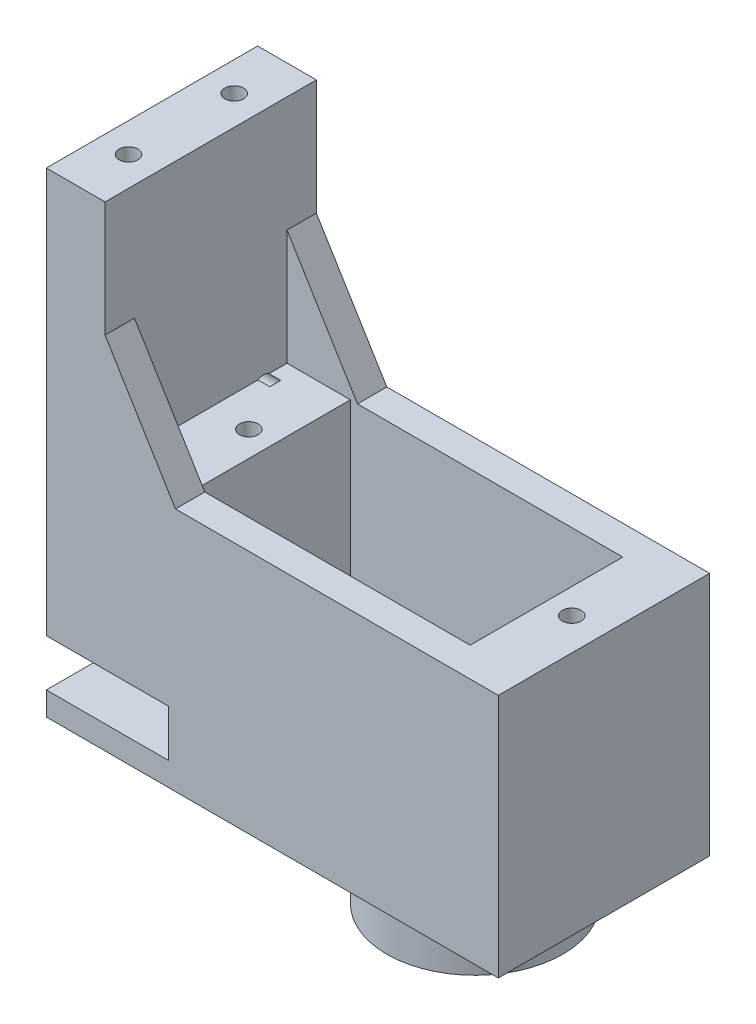
ISO-10303-21;
HEADER;
FILE_DESCRIPTION(('STEP AP214'),'2;1');
FILE_NAME('part.step','',(''),(''),'','','');
FILE_SCHEMA(('AUTOMOTIVE_DESIGN { 1 0 10303 214 1 1 1 1 }'));
ENDSEC;
DATA;
#1=APPLICATION_CONTEXT('core data for automotive mechanical design processes');
#2=APPLICATION_PROTOCOL_DEFINITION('international standard','automotive_design',2000,#1);
#3=PRODUCT_CONTEXT('',#1,'mechanical');
#4=PRODUCT('Part','Part','',(#3));
#5=PRODUCT_RELATED_PRODUCT_CATEGORY('part','',(#4));
#6=PRODUCT_DEFINITION_FORMATION('','',#4);
#7=PRODUCT_DEFINITION_CONTEXT('part definition',#1,'design');
#8=PRODUCT_DEFINITION('design','',#6,#7);
#9=PRODUCT_DEFINITION_SHAPE('','',#8);
#10=(LENGTH_UNIT() NAMED_UNIT(*) SI_UNIT(.MILLI.,.METRE.));
#11=(NAMED_UNIT(*) PLANE_ANGLE_UNIT() SI_UNIT($,.RADIAN.));
#12=(NAMED_UNIT(*) SI_UNIT($,.STERADIAN.) SOLID_ANGLE_UNIT());
#13=UNCERTAINTY_MEASURE_WITH_UNIT(LENGTH_MEASURE(1.E-05),#10,'distance_accuracy_value','');
#14=(GEOMETRIC_REPRESENTATION_CONTEXT(3) GLOBAL_UNCERTAINTY_ASSIGNED_CONTEXT((#13)) GLOBAL_UNIT_ASSIGNED_CONTEXT((#10,
#11,#12)) REPRESENTATION_CONTEXT('',''));
#15=CARTESIAN_POINT('',(0.,0.,0.));
#16=DIRECTION('',(0.,0.,1.));
#17=DIRECTION('',(1.,0.,0.));
#18=AXIS2_PLACEMENT_3D('',#15,#16,#17);
#19=CARTESIAN_POINT('',(0.,5.15,0.));
#20=DIRECTION('',(0.,-1.,0.));
#21=DIRECTION('',(0.,0.,-1.));
#22=AXIS2_PLACEMENT_3D('',#19,#20,#21);
#23=PLANE('',#22);
#24=CARTESIAN_POINT('',(-13.75,5.15,0.));
#25=DIRECTION('',(0.,1.,0.));
#26=DIRECTION('',(0.,0.,1.));
#27=AXIS2_PLACEMENT_3D('',#24,#25,#26);
#28=CIRCLE('',#27,0.800000000000001);
#29=CARTESIAN_POINT('',(-13.75,5.15,0.800000000000001));
#30=VERTEX_POINT('',#29);
#31=EDGE_CURVE('E268',#30,#30,#28,.F.);
#32=ORIENTED_EDGE('',*,*,#31,.T.);
#33=EDGE_LOOP('',(#32));
#34=FACE_BOUND('',#33,.T.);
#35=DIRECTION('',(-1.,0.,0.));
#36=VECTOR('',#35,1.);
#37=CARTESIAN_POINT('',(-16.,5.15,4.96636895265444));
#38=LINE('',#37,#36);
#39=CARTESIAN_POINT('',(-17.,5.15,4.96636895265444));
#40=VERTEX_POINT('',#39);
#41=CARTESIAN_POINT('',(-16.,5.15,4.96636895265444));
#42=VERTEX_POINT('',#41);
#43=EDGE_CURVE('E11',#40,#42,#38,.F.);
#44=ORIENTED_EDGE('',*,*,#43,.F.);
#45=DIRECTION('',(0.,0.,1.));
#46=VECTOR('',#45,1.);
#47=CARTESIAN_POINT('',(-17.,5.15,6.5));
#48=LINE('',#47,#46);
#49=CARTESIAN_POINT('',(-17.,5.15,6.5));
#50=VERTEX_POINT('',#49);
#51=EDGE_CURVE('E247',#40,#50,#48,.T.);
#52=ORIENTED_EDGE('',*,*,#51,.T.);
#53=DIRECTION('',(1.,0.,0.));
#54=VECTOR('',#53,1.);
#55=CARTESIAN_POINT('',(-17.,5.15,6.5));
#56=LINE('',#55,#54);
#57=CARTESIAN_POINT('',(-11.6,5.15,6.5));
#58=VERTEX_POINT('',#57);
#59=EDGE_CURVE('E255',#50,#58,#56,.T.);
#60=ORIENTED_EDGE('',*,*,#59,.T.);
#61=DIRECTION('',(0.,0.,1.));
#62=VECTOR('',#61,1.);
#63=CARTESIAN_POINT('',(-11.6,5.15,6.5));
#64=LINE('',#63,#62);
#65=CARTESIAN_POINT('',(-11.6,5.15,-6.5));
#66=VERTEX_POINT('',#65);
#67=EDGE_CURVE('E389',#66,#58,#64,.T.);
#68=ORIENTED_EDGE('',*,*,#67,.F.);
#69=DIRECTION('',(-1.,0.,0.));
#70=VECTOR('',#69,1.);
#71=CARTESIAN_POINT('',(-17.,5.15,-6.5));
#72=LINE('',#71,#70);
#73=CARTESIAN_POINT('',(-17.,5.15,-6.5));
#74=VERTEX_POINT('',#73);
#75=EDGE_CURVE('E260',#66,#74,#72,.T.);
#76=ORIENTED_EDGE('',*,*,#75,.T.);
#77=CARTESIAN_POINT('',(-17.,5.15,-4.96636895265444));
#78=VERTEX_POINT('',#77);
#79=EDGE_CURVE('E224',#74,#78,#48,.T.);
#80=ORIENTED_EDGE('',*,*,#79,.T.);
#81=DIRECTION('',(-1.,0.,0.));
#82=VECTOR('',#81,1.);
#83=CARTESIAN_POINT('',(-16.,5.15,-4.96636895265444));
#84=LINE('',#83,#82);
#85=CARTESIAN_POINT('',(-16.,5.15,-4.96636895265444));
#86=VERTEX_POINT('',#85);
#87=EDGE_CURVE('E210',#86,#78,#84,.T.);
#88=ORIENTED_EDGE('',*,*,#87,.F.);
#89=DIRECTION('',(0.,0.,1.));
#90=VECTOR('',#89,1.);
#91=CARTESIAN_POINT('',(-16.,5.15,0.));
#92=LINE('',#91,#90);
#93=CARTESIAN_POINT('',(-16.,5.15,-4.03363104734556));
#94=VERTEX_POINT('',#93);
#95=EDGE_CURVE('E204',#86,#94,#92,.T.);
#96=ORIENTED_EDGE('',*,*,#95,.T.);
#97=DIRECTION('',(-1.,0.,0.));
#98=VECTOR('',#97,1.);
#99=CARTESIAN_POINT('',(-16.,5.15,-4.03363104734556));
#100=LINE('',#99,#98);
#101=CARTESIAN_POINT('',(-17.,5.15,-4.03363104734556));
#102=VERTEX_POINT('',#101);
#103=EDGE_CURVE('E216',#102,#94,#100,.F.);
#104=ORIENTED_EDGE('',*,*,#103,.F.);
#105=CARTESIAN_POINT('',(-17.,5.15,4.03363104734556));
#106=VERTEX_POINT('',#105);
#107=EDGE_CURVE('E245',#102,#106,#48,.T.);
#108=ORIENTED_EDGE('',*,*,#107,.T.);
#109=DIRECTION('',(-1.,0.,0.));
#110=VECTOR('',#109,1.);
#111=CARTESIAN_POINT('',(-16.,5.15,4.03363104734556));
#112=LINE('',#111,#110);
#113=CARTESIAN_POINT('',(-16.,5.15,4.03363104734556));
#114=VERTEX_POINT('',#113);
#115=EDGE_CURVE('E48',#114,#106,#112,.T.);
#116=ORIENTED_EDGE('',*,*,#115,.F.);
#117=DIRECTION('',(0.,0.,1.));
#118=VECTOR('',#117,1.);
#119=CARTESIAN_POINT('',(-16.,5.15,0.));
#120=LINE('',#119,#118);
#121=EDGE_CURVE('E228',#114,#42,#120,.T.);
#122=ORIENTED_EDGE('',*,*,#121,.T.);
#123=EDGE_LOOP('',(#44,#52,#60,#68,#76,#80,#88,#96,#104,#108,#116,#122));
#124=FACE_BOUND('',#123,.T.);
#125=ADVANCED_FACE('F39',(#34,#124),#23,.F.);
#126=CARTESIAN_POINT('',(-11.,5.15,9.));
#127=DIRECTION('',(-0.853442833721127,-0.521186463341147,0.));
#128=DIRECTION('',(0.521186463341147,-0.853442833721127,0.));
#129=AXIS2_PLACEMENT_3D('',#126,#127,#128);
#130=PLANE('',#129);
#131=DIRECTION('',(0.,0.,-1.));
#132=VECTOR('',#131,1.);
#133=CARTESIAN_POINT('',(-17.,14.975,9.));
#134=LINE('',#133,#132);
#135=CARTESIAN_POINT('',(-17.,14.975,-6.5));
#136=VERTEX_POINT('',#135);
#137=CARTESIAN_POINT('',(-17.,14.975,-9.));
#138=VERTEX_POINT('',#137);
#139=EDGE_CURVE('E274',#136,#138,#134,.T.);
#140=ORIENTED_EDGE('',*,*,#139,.F.);
#141=DIRECTION('',(0.521186463341147,-0.853442833721127,0.));
#142=VECTOR('',#141,1.);
#143=CARTESIAN_POINT('',(-11.,5.15,-6.5));
#144=LINE('',#143,#142);
#145=CARTESIAN_POINT('',(-11.,5.15,-6.5));
#146=VERTEX_POINT('',#145);
#147=EDGE_CURVE('E211',#136,#146,#144,.T.);
#148=ORIENTED_EDGE('',*,*,#147,.T.);
#149=DIRECTION('',(0.,0.,-1.));
#150=VECTOR('',#149,1.);
#151=CARTESIAN_POINT('',(-11.,5.15,9.));
#152=LINE('',#151,#150);
#153=CARTESIAN_POINT('',(-11.,5.15,-9.));
#154=VERTEX_POINT('',#153);
#155=EDGE_CURVE('E283',#146,#154,#152,.T.);
#156=ORIENTED_EDGE('',*,*,#155,.T.);
#157=DIRECTION('',(-0.521186463341147,0.853442833721127,0.));
#158=VECTOR('',#157,1.);
#159=CARTESIAN_POINT('',(-11.,5.15,-9.));
#160=LINE('',#159,#158);
#161=EDGE_CURVE('E275',#154,#138,#160,.T.);
#162=ORIENTED_EDGE('',*,*,#161,.T.);
#163=EDGE_LOOP('',(#140,#148,#156,#162));
#164=FACE_BOUND('',#163,.T.);
#165=ADVANCED_FACE('F509',(#164),#130,.F.);
#166=CARTESIAN_POINT('',(-22.,5.15,9.));
#167=DIRECTION('',(0.,-1.,0.));
#168=DIRECTION('',(0.,0.,-1.));
#169=AXIS2_PLACEMENT_3D('',#166,#167,#168);
#170=PLANE('',#169);
#171=CARTESIAN_POINT('',(13.75,5.15,0.));
#172=DIRECTION('',(0.,1.,0.));
#173=DIRECTION('',(0.,0.,1.));
#174=AXIS2_PLACEMENT_3D('',#171,#172,#173);
#175=CIRCLE('',#174,0.800000000000001);
#176=CARTESIAN_POINT('',(13.75,5.15,0.800000000000001));
#177=VERTEX_POINT('',#176);
#178=EDGE_CURVE('E304',#177,#177,#175,.T.);
#179=ORIENTED_EDGE('',*,*,#178,.F.);
#180=EDGE_LOOP('',(#179));
#181=FACE_BOUND('',#180,.T.);
#182=CARTESIAN_POINT('',(-11.,5.15,9.));
#183=VERTEX_POINT('',#182);
#184=CARTESIAN_POINT('',(-11.,5.15,6.5));
#185=VERTEX_POINT('',#184);
#186=EDGE_CURVE('E284',#183,#185,#152,.T.);
#187=ORIENTED_EDGE('',*,*,#186,.F.);
#188=DIRECTION('',(-1.,0.,0.));
#189=VECTOR('',#188,1.);
#190=CARTESIAN_POINT('',(-22.,5.15,9.));
#191=LINE('',#190,#189);
#192=CARTESIAN_POINT('',(16.5,5.15,9.));
#193=VERTEX_POINT('',#192);
#194=EDGE_CURVE('E472',#193,#183,#191,.T.);
#195=ORIENTED_EDGE('',*,*,#194,.F.);
#196=DIRECTION('',(0.,0.,-1.));
#197=VECTOR('',#196,1.);
#198=CARTESIAN_POINT('',(16.5,5.15,9.));
#199=LINE('',#198,#197);
#200=CARTESIAN_POINT('',(16.5,5.15,-9.));
#201=VERTEX_POINT('',#200);
#202=EDGE_CURVE('E476',#193,#201,#199,.T.);
#203=ORIENTED_EDGE('',*,*,#202,.T.);
#204=DIRECTION('',(-1.,0.,0.));
#205=VECTOR('',#204,1.);
#206=CARTESIAN_POINT('',(-22.,5.15,-9.));
#207=LINE('',#206,#205);
#208=EDGE_CURVE('E487',#201,#154,#207,.T.);
#209=ORIENTED_EDGE('',*,*,#208,.T.);
#210=ORIENTED_EDGE('',*,*,#155,.F.);
#211=DIRECTION('',(-1.,0.,0.));
#212=VECTOR('',#211,1.);
#213=CARTESIAN_POINT('',(-11.6,5.15,-6.5));
#214=LINE('',#213,#212);
#215=CARTESIAN_POINT('',(11.6,5.15,-6.5));
#216=VERTEX_POINT('',#215);
#217=EDGE_CURVE('E397',#216,#146,#214,.T.);
#218=ORIENTED_EDGE('',*,*,#217,.F.);
#219=DIRECTION('',(0.,0.,-1.));
#220=VECTOR('',#219,1.);
#221=CARTESIAN_POINT('',(11.6,5.15,6.5));
#222=LINE('',#221,#220);
#223=CARTESIAN_POINT('',(11.6,5.15,6.5));
#224=VERTEX_POINT('',#223);
#225=EDGE_CURVE('E408',#224,#216,#222,.T.);
#226=ORIENTED_EDGE('',*,*,#225,.F.);
#227=DIRECTION('',(1.,0.,0.));
#228=VECTOR('',#227,1.);
#229=CARTESIAN_POINT('',(-11.6,5.15,6.5));
#230=LINE('',#229,#228);
#231=EDGE_CURVE('E405',#185,#224,#230,.T.);
#232=ORIENTED_EDGE('',*,*,#231,.F.);
#233=EDGE_LOOP('',(#187,#195,#203,#209,#210,#218,#226,#232));
#234=FACE_BOUND('',#233,.T.);
#235=ADVANCED_FACE('F516',(#181,#234),#170,.F.);
#236=CARTESIAN_POINT('',(-17.,5.15,9.));
#237=DIRECTION('',(-1.,0.,0.));
#238=DIRECTION('',(0.,0.,1.));
#239=AXIS2_PLACEMENT_3D('',#236,#237,#238);
#240=PLANE('',#239);
#241=CARTESIAN_POINT('',(-17.,4.5,4.5));
#242=DIRECTION('',(-1.,0.,0.));
#243=DIRECTION('',(0.,0.,1.));
#244=AXIS2_PLACEMENT_3D('',#241,#242,#243);
#245=CIRCLE('',#244,0.8);
#246=EDGE_CURVE('E239',#106,#40,#245,.F.);
#247=ORIENTED_EDGE('',*,*,#246,.F.);
#248=ORIENTED_EDGE('',*,*,#107,.F.);
#249=CARTESIAN_POINT('',(-17.,4.5,-4.5));
#250=DIRECTION('',(-1.,0.,0.));
#251=DIRECTION('',(0.,0.,1.));
#252=AXIS2_PLACEMENT_3D('',#249,#250,#251);
#253=CIRCLE('',#252,0.8);
#254=EDGE_CURVE('E249',#78,#102,#253,.F.);
#255=ORIENTED_EDGE('',*,*,#254,.F.);
#256=ORIENTED_EDGE('',*,*,#79,.F.);
#257=DIRECTION('',(0.,1.,0.));
#258=VECTOR('',#257,1.);
#259=CARTESIAN_POINT('',(-17.,5.15,-6.5));
#260=LINE('',#259,#258);
#261=EDGE_CURVE('E264',#74,#136,#260,.T.);
#262=ORIENTED_EDGE('',*,*,#261,.T.);
#263=ORIENTED_EDGE('',*,*,#139,.T.);
#264=DIRECTION('',(0.,1.,0.));
#265=VECTOR('',#264,1.);
#266=CARTESIAN_POINT('',(-17.,5.15,-9.));
#267=LINE('',#266,#265);
#268=CARTESIAN_POINT('',(-17.,24.8,-9.));
#269=VERTEX_POINT('',#268);
#270=EDGE_CURVE('E435',#138,#269,#267,.T.);
#271=ORIENTED_EDGE('',*,*,#270,.T.);
#272=DIRECTION('',(0.,0.,-1.));
#273=VECTOR('',#272,1.);
#274=CARTESIAN_POINT('',(-17.,24.8,9.));
#275=LINE('',#274,#273);
#276=CARTESIAN_POINT('',(-17.,24.8,9.));
#277=VERTEX_POINT('',#276);
#278=EDGE_CURVE('E456',#277,#269,#275,.T.);
#279=ORIENTED_EDGE('',*,*,#278,.F.);
#280=DIRECTION('',(0.,1.,0.));
#281=VECTOR('',#280,1.);
#282=CARTESIAN_POINT('',(-17.,5.15,9.));
#283=LINE('',#282,#281);
#284=CARTESIAN_POINT('',(-17.,14.975,9.));
#285=VERTEX_POINT('',#284);
#286=EDGE_CURVE('E439',#285,#277,#283,.T.);
#287=ORIENTED_EDGE('',*,*,#286,.F.);
#288=CARTESIAN_POINT('',(-17.,14.975,6.5));
#289=VERTEX_POINT('',#288);
#290=EDGE_CURVE('E279',#285,#289,#134,.T.);
#291=ORIENTED_EDGE('',*,*,#290,.T.);
#292=DIRECTION('',(0.,1.,0.));
#293=VECTOR('',#292,1.);
#294=CARTESIAN_POINT('',(-17.,5.15,6.5));
#295=LINE('',#294,#293);
#296=EDGE_CURVE('E263',#50,#289,#295,.T.);
#297=ORIENTED_EDGE('',*,*,#296,.F.);
#298=ORIENTED_EDGE('',*,*,#51,.F.);
#299=EDGE_LOOP('',(#247,#248,#255,#256,#262,#263,#271,#279,#287,#291,#297,#298));
#300=FACE_BOUND('',#299,.T.);
#301=ADVANCED_FACE('F244',(#300),#240,.F.);
#302=CARTESIAN_POINT('',(-22.,-15.7,9.));
#303=DIRECTION('',(1.,0.,0.));
#304=DIRECTION('',(0.,0.,-1.));
#305=AXIS2_PLACEMENT_3D('',#302,#303,#304);
#306=PLANE('',#305);
#307=CARTESIAN_POINT('',(-22.,-4.5,-4.5));
#308=DIRECTION('',(1.,0.,0.));
#309=DIRECTION('',(0.,0.,-1.));
#310=AXIS2_PLACEMENT_3D('',#307,#308,#309);
#311=CIRCLE('',#310,0.8);
#312=CARTESIAN_POINT('',(-22.,-4.5,-5.3));
#313=VERTEX_POINT('',#312);
#314=EDGE_CURVE('E609',#313,#313,#311,.T.);
#315=ORIENTED_EDGE('',*,*,#314,.T.);
#316=EDGE_LOOP('',(#315));
#317=FACE_BOUND('',#316,.T.);
#318=CARTESIAN_POINT('',(-22.,4.5,4.5));
#319=DIRECTION('',(1.,0.,0.));
#320=DIRECTION('',(0.,0.,-1.));
#321=AXIS2_PLACEMENT_3D('',#318,#319,#320);
#322=CIRCLE('',#321,0.8);
#323=CARTESIAN_POINT('',(-22.,4.5,3.7));
#324=VERTEX_POINT('',#323);
#325=EDGE_CURVE('E218',#324,#324,#322,.T.);
#326=ORIENTED_EDGE('',*,*,#325,.T.);
#327=EDGE_LOOP('',(#326));
#328=FACE_BOUND('',#327,.T.);
#329=CARTESIAN_POINT('',(-22.,4.5,-4.5));
#330=DIRECTION('',(1.,0.,0.));
#331=DIRECTION('',(0.,0.,-1.));
#332=AXIS2_PLACEMENT_3D('',#329,#330,#331);
#333=CIRCLE('',#332,0.8);
#334=CARTESIAN_POINT('',(-22.,4.5,-5.3));
#335=VERTEX_POINT('',#334);
#336=EDGE_CURVE('E219',#335,#335,#333,.T.);
#337=ORIENTED_EDGE('',*,*,#336,.T.);
#338=EDGE_LOOP('',(#337));
#339=FACE_BOUND('',#338,.T.);
#340=CARTESIAN_POINT('',(-22.,-4.5,4.5));
#341=DIRECTION('',(1.,0.,0.));
#342=DIRECTION('',(0.,0.,-1.));
#343=AXIS2_PLACEMENT_3D('',#340,#341,#342);
#344=CIRCLE('',#343,0.8);
#345=CARTESIAN_POINT('',(-22.,-4.5,3.7));
#346=VERTEX_POINT('',#345);
#347=EDGE_CURVE('E597',#346,#346,#344,.T.);
#348=ORIENTED_EDGE('',*,*,#347,.T.);
#349=EDGE_LOOP('',(#348));
#350=FACE_BOUND('',#349,.T.);
#351=DIRECTION('',(0.,-1.,0.));
#352=VECTOR('',#351,1.);
#353=CARTESIAN_POINT('',(-22.,-15.7,-9.));
#354=LINE('',#353,#352);
#355=CARTESIAN_POINT('',(-22.,24.8,-9.));
#356=VERTEX_POINT('',#355);
#357=CARTESIAN_POINT('',(-22.,-9.7,-9.));
#358=VERTEX_POINT('',#357);
#359=EDGE_CURVE('E477',#356,#358,#354,.T.);
#360=ORIENTED_EDGE('',*,*,#359,.T.);
#361=DIRECTION('',(0.,0.,1.));
#362=VECTOR('',#361,1.);
#363=CARTESIAN_POINT('',(-22.,-9.7,-9.));
#364=LINE('',#363,#362);
#365=CARTESIAN_POINT('',(-22.,-9.7,9.));
#366=VERTEX_POINT('',#365);
#367=EDGE_CURVE('E343',#358,#366,#364,.T.);
#368=ORIENTED_EDGE('',*,*,#367,.T.);
#369=DIRECTION('',(0.,-1.,0.));
#370=VECTOR('',#369,1.);
#371=CARTESIAN_POINT('',(-22.,-15.7,9.));
#372=LINE('',#371,#370);
#373=CARTESIAN_POINT('',(-22.,24.8,9.));
#374=VERTEX_POINT('',#373);
#375=EDGE_CURVE('E461',#374,#366,#372,.T.);
#376=ORIENTED_EDGE('',*,*,#375,.F.);
#377=DIRECTION('',(0.,0.,-1.));
#378=VECTOR('',#377,1.);
#379=CARTESIAN_POINT('',(-22.,24.8,9.));
#380=LINE('',#379,#378);
#381=EDGE_CURVE('E447',#374,#356,#380,.T.);
#382=ORIENTED_EDGE('',*,*,#381,.T.);
#383=EDGE_LOOP('',(#360,#368,#376,#382));
#384=FACE_BOUND('',#383,.T.);
#385=ADVANCED_FACE('F557',(#317,#328,#339,#350,#384),#306,.F.);
#386=CARTESIAN_POINT('',(11.6,-13.7,6.5));
#387=DIRECTION('',(1.,0.,0.));
#388=DIRECTION('',(0.,0.,-1.));
#389=AXIS2_PLACEMENT_3D('',#386,#387,#388);
#390=PLANE('',#389);
#391=DIRECTION('',(0.,0.,1.));
#392=VECTOR('',#391,1.);
#393=CARTESIAN_POINT('',(11.6,-7.9,6.5));
#394=LINE('',#393,#392);
#395=CARTESIAN_POINT('',(11.6,-7.9,-6.5));
#396=VERTEX_POINT('',#395);
#397=CARTESIAN_POINT('',(11.6,-7.9,6.5));
#398=VERTEX_POINT('',#397);
#399=EDGE_CURVE('E360',#396,#398,#394,.T.);
#400=ORIENTED_EDGE('',*,*,#399,.T.);
#401=DIRECTION('',(0.,1.,0.));
#402=VECTOR('',#401,1.);
#403=CARTESIAN_POINT('',(11.6,-13.7,6.5));
#404=LINE('',#403,#402);
#405=EDGE_CURVE('E423',#398,#224,#404,.T.);
#406=ORIENTED_EDGE('',*,*,#405,.T.);
#407=ORIENTED_EDGE('',*,*,#225,.T.);
#408=DIRECTION('',(0.,1.,0.));
#409=VECTOR('',#408,1.);
#410=CARTESIAN_POINT('',(11.6,-13.7,-6.5));
#411=LINE('',#410,#409);
#412=EDGE_CURVE('E420',#396,#216,#411,.T.);
#413=ORIENTED_EDGE('',*,*,#412,.F.);
#414=EDGE_LOOP('',(#400,#406,#407,#413));
#415=FACE_BOUND('',#414,.T.);
#416=ADVANCED_FACE('F526',(#415),#390,.F.);
#417=CARTESIAN_POINT('',(-22.,-13.7,9.));
#418=VERTEX_POINT('',#417);
#419=CARTESIAN_POINT('',(-22.,-15.7,9.));
#420=VERTEX_POINT('',#419);
#421=EDGE_CURVE('E466',#418,#420,#372,.T.);
#422=ORIENTED_EDGE('',*,*,#421,.F.);
#423=DIRECTION('',(0.,0.,1.));
#424=VECTOR('',#423,1.);
#425=CARTESIAN_POINT('',(-22.,-13.7,-9.));
#426=LINE('',#425,#424);
#427=CARTESIAN_POINT('',(-22.,-13.7,-9.));
#428=VERTEX_POINT('',#427);
#429=EDGE_CURVE('E342',#428,#418,#426,.T.);
#430=ORIENTED_EDGE('',*,*,#429,.F.);
#431=CARTESIAN_POINT('',(-22.,-15.7,-9.));
#432=VERTEX_POINT('',#431);
#433=EDGE_CURVE('E460',#428,#432,#354,.T.);
#434=ORIENTED_EDGE('',*,*,#433,.T.);
#435=DIRECTION('',(0.,0.,-1.));
#436=VECTOR('',#435,1.);
#437=CARTESIAN_POINT('',(-22.,-15.7,9.));
#438=LINE('',#437,#436);
#439=EDGE_CURVE('E498',#420,#432,#438,.T.);
#440=ORIENTED_EDGE('',*,*,#439,.F.);
#441=EDGE_LOOP('',(#422,#430,#434,#440));
#442=FACE_BOUND('',#441,.T.);
#443=ADVANCED_FACE('F41',(#442),#306,.F.);
#444=CARTESIAN_POINT('',(-22.,-15.7,9.));
#445=DIRECTION('',(0.,1.,0.));
#446=DIRECTION('',(0.,0.,1.));
#447=AXIS2_PLACEMENT_3D('',#444,#445,#446);
#448=PLANE('',#447);
#449=CARTESIAN_POINT('',(5.5,-15.7,0.));
#450=DIRECTION('',(0.,1.,0.));
#451=DIRECTION('',(0.,0.,1.));
#452=AXIS2_PLACEMENT_3D('',#449,#450,#451);
#453=CIRCLE('',#452,7.5);
#454=CARTESIAN_POINT('',(5.5,-15.7,7.5));
#455=VERTEX_POINT('',#454);
#456=EDGE_CURVE('E431',#455,#455,#453,.T.);
#457=ORIENTED_EDGE('',*,*,#456,.T.);
#458=EDGE_LOOP('',(#457));
#459=FACE_BOUND('',#458,.T.);
#460=DIRECTION('',(1.,0.,0.));
#461=VECTOR('',#460,1.);
#462=CARTESIAN_POINT('',(-22.,-15.7,-9.));
#463=LINE('',#462,#461);
#464=CARTESIAN_POINT('',(16.5,-15.7,-9.));
#465=VERTEX_POINT('',#464);
#466=EDGE_CURVE('E481',#432,#465,#463,.T.);
#467=ORIENTED_EDGE('',*,*,#466,.T.);
#468=DIRECTION('',(0.,0.,-1.));
#469=VECTOR('',#468,1.);
#470=CARTESIAN_POINT('',(16.5,-15.7,9.));
#471=LINE('',#470,#469);
#472=CARTESIAN_POINT('',(16.5,-15.7,9.));
#473=VERTEX_POINT('',#472);
#474=EDGE_CURVE('E494',#473,#465,#471,.T.);
#475=ORIENTED_EDGE('',*,*,#474,.F.);
#476=DIRECTION('',(1.,0.,0.));
#477=VECTOR('',#476,1.);
#478=CARTESIAN_POINT('',(-22.,-15.7,9.));
#479=LINE('',#478,#477);
#480=EDGE_CURVE('E465',#420,#473,#479,.T.);
#481=ORIENTED_EDGE('',*,*,#480,.F.);
#482=ORIENTED_EDGE('',*,*,#439,.T.);
#483=EDGE_LOOP('',(#467,#475,#481,#482));
#484=FACE_BOUND('',#483,.T.);
#485=ADVANCED_FACE('F725',(#459,#484),#448,.F.);
#486=CARTESIAN_POINT('',(16.5,-15.7,9.));
#487=DIRECTION('',(-1.,0.,0.));
#488=DIRECTION('',(0.,0.,1.));
#489=AXIS2_PLACEMENT_3D('',#486,#487,#488);
#490=PLANE('',#489);
#491=DIRECTION('',(0.,1.,0.));
#492=VECTOR('',#491,1.);
#493=CARTESIAN_POINT('',(16.5,-15.7,-9.));
#494=LINE('',#493,#492);
#495=EDGE_CURVE('E484',#465,#201,#494,.T.);
#496=ORIENTED_EDGE('',*,*,#495,.T.);
#497=ORIENTED_EDGE('',*,*,#202,.F.);
#498=DIRECTION('',(0.,1.,0.));
#499=VECTOR('',#498,1.);
#500=CARTESIAN_POINT('',(16.5,-15.7,9.));
#501=LINE('',#500,#499);
#502=EDGE_CURVE('E469',#473,#193,#501,.T.);
#503=ORIENTED_EDGE('',*,*,#502,.F.);
#504=ORIENTED_EDGE('',*,*,#474,.T.);
#505=EDGE_LOOP('',(#496,#497,#503,#504));
#506=FACE_BOUND('',#505,.T.);
#507=ADVANCED_FACE('F718',(#506),#490,.F.);
#508=CARTESIAN_POINT('',(0.,0.,9.));
#509=DIRECTION('',(0.,0.,-1.));
#510=DIRECTION('',(-1.,0.,0.));
#511=AXIS2_PLACEMENT_3D('',#508,#509,#510);
#512=PLANE('',#511);
#513=ORIENTED_EDGE('',*,*,#194,.T.);
#514=DIRECTION('',(-0.521186463341147,0.853442833721127,0.));
#515=VECTOR('',#514,1.);
#516=CARTESIAN_POINT('',(-11.,5.15,9.));
#517=LINE('',#516,#515);
#518=EDGE_CURVE('E271',#183,#285,#517,.T.);
#519=ORIENTED_EDGE('',*,*,#518,.T.);
#520=ORIENTED_EDGE('',*,*,#286,.T.);
#521=DIRECTION('',(-1.,0.,0.));
#522=VECTOR('',#521,1.);
#523=CARTESIAN_POINT('',(-22.,24.8,9.));
#524=LINE('',#523,#522);
#525=EDGE_CURVE('E442',#277,#374,#524,.T.);
#526=ORIENTED_EDGE('',*,*,#525,.T.);
#527=ORIENTED_EDGE('',*,*,#375,.T.);
#528=DIRECTION('',(-1.,0.,0.));
#529=VECTOR('',#528,1.);
#530=CARTESIAN_POINT('',(-22.,-9.7,9.));
#531=LINE('',#530,#529);
#532=CARTESIAN_POINT('',(-11.6,-9.7,9.));
#533=VERTEX_POINT('',#532);
#534=EDGE_CURVE('E327',#533,#366,#531,.T.);
#535=ORIENTED_EDGE('',*,*,#534,.F.);
#536=DIRECTION('',(0.,1.,0.));
#537=VECTOR('',#536,1.);
#538=CARTESIAN_POINT('',(-11.6,-13.7,9.));
#539=LINE('',#538,#537);
#540=CARTESIAN_POINT('',(-11.6,-13.7,9.));
#541=VERTEX_POINT('',#540);
#542=EDGE_CURVE('E323',#541,#533,#539,.T.);
#543=ORIENTED_EDGE('',*,*,#542,.F.);
#544=DIRECTION('',(1.,0.,0.));
#545=VECTOR('',#544,1.);
#546=CARTESIAN_POINT('',(-22.,-13.7,9.));
#547=LINE('',#546,#545);
#548=EDGE_CURVE('E319',#418,#541,#547,.T.);
#549=ORIENTED_EDGE('',*,*,#548,.F.);
#550=ORIENTED_EDGE('',*,*,#421,.T.);
#551=ORIENTED_EDGE('',*,*,#480,.T.);
#552=ORIENTED_EDGE('',*,*,#502,.T.);
#553=EDGE_LOOP('',(#513,#519,#520,#526,#527,#535,#543,#549,#550,#551,#552));
#554=FACE_BOUND('',#553,.T.);
#555=ADVANCED_FACE('F539',(#554),#512,.F.);
#556=CARTESIAN_POINT('',(0.,0.,-9.));
#557=DIRECTION('',(0.,0.,-1.));
#558=DIRECTION('',(-1.,0.,0.));
#559=AXIS2_PLACEMENT_3D('',#556,#557,#558);
#560=PLANE('',#559);
#561=ORIENTED_EDGE('',*,*,#161,.F.);
#562=ORIENTED_EDGE('',*,*,#208,.F.);
#563=ORIENTED_EDGE('',*,*,#495,.F.);
#564=ORIENTED_EDGE('',*,*,#466,.F.);
#565=ORIENTED_EDGE('',*,*,#433,.F.);
#566=DIRECTION('',(1.,0.,0.));
#567=VECTOR('',#566,1.);
#568=CARTESIAN_POINT('',(-22.,-13.7,-9.));
#569=LINE('',#568,#567);
#570=CARTESIAN_POINT('',(-11.6,-13.7,-9.));
#571=VERTEX_POINT('',#570);
#572=EDGE_CURVE('E330',#428,#571,#569,.T.);
#573=ORIENTED_EDGE('',*,*,#572,.T.);
#574=DIRECTION('',(0.,1.,0.));
#575=VECTOR('',#574,1.);
#576=CARTESIAN_POINT('',(-11.6,-13.7,-9.));
#577=LINE('',#576,#575);
#578=CARTESIAN_POINT('',(-11.6,-9.7,-9.));
#579=VERTEX_POINT('',#578);
#580=EDGE_CURVE('E334',#571,#579,#577,.T.);
#581=ORIENTED_EDGE('',*,*,#580,.T.);
#582=DIRECTION('',(-1.,0.,0.));
#583=VECTOR('',#582,1.);
#584=CARTESIAN_POINT('',(-22.,-9.7,-9.));
#585=LINE('',#584,#583);
#586=EDGE_CURVE('E338',#579,#358,#585,.T.);
#587=ORIENTED_EDGE('',*,*,#586,.T.);
#588=ORIENTED_EDGE('',*,*,#359,.F.);
#589=DIRECTION('',(-1.,0.,0.));
#590=VECTOR('',#589,1.);
#591=CARTESIAN_POINT('',(-22.,24.8,-9.));
#592=LINE('',#591,#590);
#593=EDGE_CURVE('E443',#269,#356,#592,.T.);
#594=ORIENTED_EDGE('',*,*,#593,.F.);
#595=ORIENTED_EDGE('',*,*,#270,.F.);
#596=EDGE_LOOP('',(#561,#562,#563,#564,#565,#573,#581,#587,#588,#594,#595));
#597=FACE_BOUND('',#596,.T.);
#598=ADVANCED_FACE('F546',(#597),#560,.T.);
#599=CARTESIAN_POINT('',(-22.,24.8,9.));
#600=DIRECTION('',(0.,-1.,0.));
#601=DIRECTION('',(0.,0.,-1.));
#602=AXIS2_PLACEMENT_3D('',#599,#600,#601);
#603=PLANE('',#602);
#604=CARTESIAN_POINT('',(-19.5,24.8,-4.5));
#605=DIRECTION('',(0.,1.,0.));
#606=DIRECTION('',(0.,0.,1.));
#607=AXIS2_PLACEMENT_3D('',#604,#605,#606);
#608=CIRCLE('',#607,0.799999999999999);
#609=CARTESIAN_POINT('',(-19.5,24.8,-3.7));
#610=VERTEX_POINT('',#609);
#611=EDGE_CURVE('E288',#610,#610,#608,.T.);
#612=ORIENTED_EDGE('',*,*,#611,.F.);
#613=EDGE_LOOP('',(#612));
#614=FACE_BOUND('',#613,.T.);
#615=CARTESIAN_POINT('',(-19.5,24.8,4.5));
#616=DIRECTION('',(0.,1.,0.));
#617=DIRECTION('',(0.,0.,1.));
#618=AXIS2_PLACEMENT_3D('',#615,#616,#617);
#619=CIRCLE('',#618,0.799999999999999);
#620=CARTESIAN_POINT('',(-19.5,24.8,5.3));
#621=VERTEX_POINT('',#620);
#622=EDGE_CURVE('E296',#621,#621,#619,.T.);
#623=ORIENTED_EDGE('',*,*,#622,.F.);
#624=EDGE_LOOP('',(#623));
#625=FACE_BOUND('',#624,.T.);
#626=ORIENTED_EDGE('',*,*,#593,.T.);
#627=ORIENTED_EDGE('',*,*,#381,.F.);
#628=ORIENTED_EDGE('',*,*,#525,.F.);
#629=ORIENTED_EDGE('',*,*,#278,.T.);
#630=EDGE_LOOP('',(#626,#627,#628,#629));
#631=FACE_BOUND('',#630,.T.);
#632=ADVANCED_FACE('F552',(#614,#625,#631),#603,.F.);
#633=CARTESIAN_POINT('',(5.5,-15.7,0.));
#634=DIRECTION('',(0.,-1.,0.));
#635=DIRECTION('',(0.,0.,-1.));
#636=AXIS2_PLACEMENT_3D('',#633,#634,#635);
#637=CYLINDRICAL_SURFACE('',#636,7.5);
#638=ORIENTED_EDGE('',*,*,#456,.F.);
#639=EDGE_LOOP('',(#638));
#640=FACE_BOUND('',#639,.T.);
#641=CARTESIAN_POINT('',(5.5,-20.2,0.));
#642=DIRECTION('',(0.,1.,0.));
#643=DIRECTION('',(0.,0.,1.));
#644=AXIS2_PLACEMENT_3D('',#641,#642,#643);
#645=CIRCLE('',#644,7.5);
#646=CARTESIAN_POINT('',(5.5,-20.2,7.5));
#647=VERTEX_POINT('',#646);
#648=EDGE_CURVE('E418',#647,#647,#645,.T.);
#649=ORIENTED_EDGE('',*,*,#648,.T.);
#650=EDGE_LOOP('',(#649));
#651=FACE_BOUND('',#650,.T.);
#652=ADVANCED_FACE('F706',(#640,#651),#637,.T.);
#653=CARTESIAN_POINT('',(5.5,-20.2,0.));
#654=DIRECTION('',(0.,1.,0.));
#655=DIRECTION('',(0.,0.,1.));
#656=AXIS2_PLACEMENT_3D('',#653,#654,#655);
#657=PLANE('',#656);
#658=CARTESIAN_POINT('',(5.5,-20.2,0.));
#659=DIRECTION('',(0.,1.,0.));
#660=DIRECTION('',(0.,0.,1.));
#661=AXIS2_PLACEMENT_3D('',#658,#659,#660);
#662=CIRCLE('',#661,5.);
#663=CARTESIAN_POINT('',(5.5,-20.2,5.));
#664=VERTEX_POINT('',#663);
#665=EDGE_CURVE('E384',#664,#664,#662,.T.);
#666=ORIENTED_EDGE('',*,*,#665,.T.);
#667=EDGE_LOOP('',(#666));
#668=FACE_BOUND('',#667,.T.);
#669=ORIENTED_EDGE('',*,*,#648,.F.);
#670=EDGE_LOOP('',(#669));
#671=FACE_BOUND('',#670,.T.);
#672=ADVANCED_FACE('F703',(#668,#671),#657,.F.);
#673=CARTESIAN_POINT('',(-11.6,-13.7,6.5));
#674=DIRECTION('',(-1.,0.,0.));
#675=DIRECTION('',(0.,0.,1.));
#676=AXIS2_PLACEMENT_3D('',#673,#674,#675);
#677=PLANE('',#676);
#678=DIRECTION('',(0.,1.,0.));
#679=VECTOR('',#678,1.);
#680=CARTESIAN_POINT('',(-11.6,-13.7,6.5));
#681=LINE('',#680,#679);
#682=CARTESIAN_POINT('',(-11.6,-9.7,6.5));
#683=VERTEX_POINT('',#682);
#684=EDGE_CURVE('E401',#683,#58,#681,.T.);
#685=ORIENTED_EDGE('',*,*,#684,.F.);
#686=DIRECTION('',(0.,0.,1.));
#687=VECTOR('',#686,1.);
#688=CARTESIAN_POINT('',(-11.6,-9.7,-9.));
#689=LINE('',#688,#687);
#690=CARTESIAN_POINT('',(-11.6,-9.7,-6.5));
#691=VERTEX_POINT('',#690);
#692=EDGE_CURVE('E352',#691,#683,#689,.T.);
#693=ORIENTED_EDGE('',*,*,#692,.F.);
#694=DIRECTION('',(0.,1.,0.));
#695=VECTOR('',#694,1.);
#696=CARTESIAN_POINT('',(-11.6,-13.7,-6.5));
#697=LINE('',#696,#695);
#698=EDGE_CURVE('E419',#691,#66,#697,.T.);
#699=ORIENTED_EDGE('',*,*,#698,.T.);
#700=ORIENTED_EDGE('',*,*,#67,.T.);
#701=EDGE_LOOP('',(#685,#693,#699,#700));
#702=FACE_BOUND('',#701,.T.);
#703=ADVANCED_FACE('F577',(#702),#677,.F.);
#704=CARTESIAN_POINT('',(-11.6,-13.7,-6.5));
#705=DIRECTION('',(0.,0.,-1.));
#706=DIRECTION('',(-1.,0.,0.));
#707=AXIS2_PLACEMENT_3D('',#704,#705,#706);
#708=PLANE('',#707);
#709=ORIENTED_EDGE('',*,*,#217,.T.);
#710=ORIENTED_EDGE('',*,*,#147,.F.);
#711=ORIENTED_EDGE('',*,*,#261,.F.);
#712=ORIENTED_EDGE('',*,*,#75,.F.);
#713=ORIENTED_EDGE('',*,*,#698,.F.);
#714=CARTESIAN_POINT('',(-11.6,-13.7,-6.5));
#715=VERTEX_POINT('',#714);
#716=EDGE_CURVE('E415',#715,#691,#697,.T.);
#717=ORIENTED_EDGE('',*,*,#716,.F.);
#718=DIRECTION('',(-1.,0.,0.));
#719=VECTOR('',#718,1.);
#720=CARTESIAN_POINT('',(-11.6,-13.7,-6.5));
#721=LINE('',#720,#719);
#722=CARTESIAN_POINT('',(13.,-13.7,-6.5));
#723=VERTEX_POINT('',#722);
#724=EDGE_CURVE('E396',#723,#715,#721,.T.);
#725=ORIENTED_EDGE('',*,*,#724,.F.);
#726=DIRECTION('',(0.,-1.,0.));
#727=VECTOR('',#726,1.);
#728=CARTESIAN_POINT('',(13.,-7.9,-6.5));
#729=LINE('',#728,#727);
#730=CARTESIAN_POINT('',(13.,-7.9,-6.5));
#731=VERTEX_POINT('',#730);
#732=EDGE_CURVE('E373',#731,#723,#729,.T.);
#733=ORIENTED_EDGE('',*,*,#732,.F.);
#734=DIRECTION('',(-1.,0.,0.));
#735=VECTOR('',#734,1.);
#736=CARTESIAN_POINT('',(11.6,-7.9,-6.5));
#737=LINE('',#736,#735);
#738=EDGE_CURVE('E370',#731,#396,#737,.T.);
#739=ORIENTED_EDGE('',*,*,#738,.T.);
#740=ORIENTED_EDGE('',*,*,#412,.T.);
#741=EDGE_LOOP('',(#709,#710,#711,#712,#713,#717,#725,#733,#739,#740));
#742=FACE_BOUND('',#741,.T.);
#743=ADVANCED_FACE('F520',(#742),#708,.F.);
#744=CARTESIAN_POINT('',(-11.6,-13.7,6.5));
#745=DIRECTION('',(0.,0.,1.));
#746=DIRECTION('',(1.,0.,0.));
#747=AXIS2_PLACEMENT_3D('',#744,#745,#746);
#748=PLANE('',#747);
#749=ORIENTED_EDGE('',*,*,#684,.T.);
#750=ORIENTED_EDGE('',*,*,#59,.F.);
#751=ORIENTED_EDGE('',*,*,#296,.T.);
#752=DIRECTION('',(-0.521186463341147,0.853442833721127,0.));
#753=VECTOR('',#752,1.);
#754=CARTESIAN_POINT('',(-11.,5.15,6.5));
#755=LINE('',#754,#753);
#756=EDGE_CURVE('E502',#185,#289,#755,.T.);
#757=ORIENTED_EDGE('',*,*,#756,.F.);
#758=ORIENTED_EDGE('',*,*,#231,.T.);
#759=ORIENTED_EDGE('',*,*,#405,.F.);
#760=DIRECTION('',(1.,0.,0.));
#761=VECTOR('',#760,1.);
#762=CARTESIAN_POINT('',(11.6,-7.9,6.5));
#763=LINE('',#762,#761);
#764=CARTESIAN_POINT('',(13.,-7.9,6.5));
#765=VERTEX_POINT('',#764);
#766=EDGE_CURVE('E364',#398,#765,#763,.T.);
#767=ORIENTED_EDGE('',*,*,#766,.T.);
#768=DIRECTION('',(0.,-1.,0.));
#769=VECTOR('',#768,1.);
#770=CARTESIAN_POINT('',(13.,-7.9,6.5));
#771=LINE('',#770,#769);
#772=CARTESIAN_POINT('',(13.,-13.7,6.5));
#773=VERTEX_POINT('',#772);
#774=EDGE_CURVE('E380',#765,#773,#771,.T.);
#775=ORIENTED_EDGE('',*,*,#774,.T.);
#776=DIRECTION('',(1.,0.,0.));
#777=VECTOR('',#776,1.);
#778=CARTESIAN_POINT('',(-11.6,-13.7,6.5));
#779=LINE('',#778,#777);
#780=CARTESIAN_POINT('',(-11.6,-13.7,6.5));
#781=VERTEX_POINT('',#780);
#782=EDGE_CURVE('E393',#781,#773,#779,.T.);
#783=ORIENTED_EDGE('',*,*,#782,.F.);
#784=EDGE_CURVE('E427',#781,#683,#681,.T.);
#785=ORIENTED_EDGE('',*,*,#784,.T.);
#786=EDGE_LOOP('',(#749,#750,#751,#757,#758,#759,#767,#775,#783,#785));
#787=FACE_BOUND('',#786,.T.);
#788=ADVANCED_FACE('F532',(#787),#748,.F.);
#789=CARTESIAN_POINT('',(0.,-13.7,0.));
#790=DIRECTION('',(0.,-1.,0.));
#791=DIRECTION('',(0.,0.,-1.));
#792=AXIS2_PLACEMENT_3D('',#789,#790,#791);
#793=PLANE('',#792);
#794=ORIENTED_EDGE('',*,*,#724,.T.);
#795=DIRECTION('',(0.,0.,1.));
#796=VECTOR('',#795,1.);
#797=CARTESIAN_POINT('',(-11.6,-13.7,-9.));
#798=LINE('',#797,#796);
#799=EDGE_CURVE('E354',#571,#715,#798,.T.);
#800=ORIENTED_EDGE('',*,*,#799,.F.);
#801=ORIENTED_EDGE('',*,*,#572,.F.);
#802=ORIENTED_EDGE('',*,*,#429,.T.);
#803=ORIENTED_EDGE('',*,*,#548,.T.);
#804=EDGE_CURVE('E357',#781,#541,#798,.T.);
#805=ORIENTED_EDGE('',*,*,#804,.F.);
#806=ORIENTED_EDGE('',*,*,#782,.T.);
#807=DIRECTION('',(0.,0.,-1.));
#808=VECTOR('',#807,1.);
#809=CARTESIAN_POINT('',(13.,-13.7,6.5));
#810=LINE('',#809,#808);
#811=EDGE_CURVE('E347',#773,#723,#810,.T.);
#812=ORIENTED_EDGE('',*,*,#811,.T.);
#813=EDGE_LOOP('',(#794,#800,#801,#802,#803,#805,#806,#812));
#814=FACE_BOUND('',#813,.T.);
#815=ADVANCED_FACE('F567',(#814),#793,.F.);
#816=CARTESIAN_POINT('',(5.5,-16.2,0.));
#817=DIRECTION('',(0.,-1.,0.));
#818=DIRECTION('',(0.,0.,-1.));
#819=AXIS2_PLACEMENT_3D('',#816,#817,#818);
#820=CYLINDRICAL_SURFACE('',#819,5.);
#821=CARTESIAN_POINT('',(5.5,-16.2,0.));
#822=DIRECTION('',(0.,1.,0.));
#823=DIRECTION('',(0.,0.,1.));
#824=AXIS2_PLACEMENT_3D('',#821,#822,#823);
#825=CIRCLE('',#824,5.);
#826=CARTESIAN_POINT('',(5.5,-16.2,5.));
#827=VERTEX_POINT('',#826);
#828=EDGE_CURVE('E385',#827,#827,#825,.T.);
#829=ORIENTED_EDGE('',*,*,#828,.T.);
#830=EDGE_LOOP('',(#829));
#831=FACE_BOUND('',#830,.T.);
#832=ORIENTED_EDGE('',*,*,#665,.F.);
#833=EDGE_LOOP('',(#832));
#834=FACE_BOUND('',#833,.T.);
#835=ADVANCED_FACE('F688',(#831,#834),#820,.F.);
#836=CARTESIAN_POINT('',(5.5,-16.2,0.));
#837=DIRECTION('',(0.,1.,0.));
#838=DIRECTION('',(0.,0.,1.));
#839=AXIS2_PLACEMENT_3D('',#836,#837,#838);
#840=PLANE('',#839);
#841=ORIENTED_EDGE('',*,*,#828,.F.);
#842=EDGE_LOOP('',(#841));
#843=FACE_BOUND('',#842,.T.);
#844=ADVANCED_FACE('F684',(#843),#840,.F.);
#845=CARTESIAN_POINT('',(13.,-7.9,6.5));
#846=DIRECTION('',(-1.,0.,0.));
#847=DIRECTION('',(0.,0.,1.));
#848=AXIS2_PLACEMENT_3D('',#845,#846,#847);
#849=PLANE('',#848);
#850=ORIENTED_EDGE('',*,*,#811,.F.);
#851=ORIENTED_EDGE('',*,*,#774,.F.);
#852=DIRECTION('',(0.,0.,-1.));
#853=VECTOR('',#852,1.);
#854=CARTESIAN_POINT('',(13.,-7.9,6.5));
#855=LINE('',#854,#853);
#856=EDGE_CURVE('E367',#765,#731,#855,.T.);
#857=ORIENTED_EDGE('',*,*,#856,.T.);
#858=ORIENTED_EDGE('',*,*,#732,.T.);
#859=EDGE_LOOP('',(#850,#851,#857,#858));
#860=FACE_BOUND('',#859,.T.);
#861=ADVANCED_FACE('F680',(#860),#849,.T.);
#862=CARTESIAN_POINT('',(0.,-7.9,0.));
#863=DIRECTION('',(0.,-1.,0.));
#864=DIRECTION('',(0.,0.,-1.));
#865=AXIS2_PLACEMENT_3D('',#862,#863,#864);
#866=PLANE('',#865);
#867=ORIENTED_EDGE('',*,*,#399,.F.);
#868=ORIENTED_EDGE('',*,*,#738,.F.);
#869=ORIENTED_EDGE('',*,*,#856,.F.);
#870=ORIENTED_EDGE('',*,*,#766,.F.);
#871=EDGE_LOOP('',(#867,#868,#869,#870));
#872=FACE_BOUND('',#871,.T.);
#873=ADVANCED_FACE('F677',(#872),#866,.T.);
#874=CARTESIAN_POINT('',(-11.6,-13.7,-9.));
#875=DIRECTION('',(1.,0.,0.));
#876=DIRECTION('',(0.,0.,-1.));
#877=AXIS2_PLACEMENT_3D('',#874,#875,#876);
#878=PLANE('',#877);
#879=EDGE_CURVE('E348',#579,#691,#689,.T.);
#880=ORIENTED_EDGE('',*,*,#879,.F.);
#881=ORIENTED_EDGE('',*,*,#580,.F.);
#882=ORIENTED_EDGE('',*,*,#799,.T.);
#883=ORIENTED_EDGE('',*,*,#716,.T.);
#884=EDGE_LOOP('',(#880,#881,#882,#883));
#885=FACE_BOUND('',#884,.T.);
#886=ADVANCED_FACE('F564',(#885),#878,.F.);
#887=ORIENTED_EDGE('',*,*,#804,.T.);
#888=ORIENTED_EDGE('',*,*,#542,.T.);
#889=EDGE_CURVE('E353',#683,#533,#689,.T.);
#890=ORIENTED_EDGE('',*,*,#889,.F.);
#891=ORIENTED_EDGE('',*,*,#784,.F.);
#892=EDGE_LOOP('',(#887,#888,#890,#891));
#893=FACE_BOUND('',#892,.T.);
#894=ADVANCED_FACE('F582',(#893),#878,.F.);
#895=CARTESIAN_POINT('',(-22.,-9.7,-9.));
#896=DIRECTION('',(0.,1.,0.));
#897=DIRECTION('',(0.,0.,1.));
#898=AXIS2_PLACEMENT_3D('',#895,#896,#897);
#899=PLANE('',#898);
#900=ORIENTED_EDGE('',*,*,#367,.F.);
#901=ORIENTED_EDGE('',*,*,#586,.F.);
#902=ORIENTED_EDGE('',*,*,#879,.T.);
#903=ORIENTED_EDGE('',*,*,#692,.T.);
#904=ORIENTED_EDGE('',*,*,#889,.T.);
#905=ORIENTED_EDGE('',*,*,#534,.T.);
#906=EDGE_LOOP('',(#900,#901,#902,#903,#904,#905));
#907=FACE_BOUND('',#906,.T.);
#908=ADVANCED_FACE('F560',(#907),#899,.F.);
#909=CARTESIAN_POINT('',(13.75,-2.85,0.));
#910=DIRECTION('',(0.,1.,0.));
#911=DIRECTION('',(0.,0.,1.));
#912=AXIS2_PLACEMENT_3D('',#909,#910,#911);
#913=CYLINDRICAL_SURFACE('',#912,0.800000000000001);
#914=CARTESIAN_POINT('',(13.75,-2.85,0.));
#915=DIRECTION('',(0.,1.,0.));
#916=DIRECTION('',(0.,0.,1.));
#917=AXIS2_PLACEMENT_3D('',#914,#915,#916);
#918=CIRCLE('',#917,0.800000000000001);
#919=CARTESIAN_POINT('',(13.75,-2.85,0.800000000000001));
#920=VERTEX_POINT('',#919);
#921=EDGE_CURVE('E308',#920,#920,#918,.T.);
#922=ORIENTED_EDGE('',*,*,#921,.F.);
#923=EDGE_LOOP('',(#922));
#924=FACE_BOUND('',#923,.T.);
#925=ORIENTED_EDGE('',*,*,#178,.T.);
#926=EDGE_LOOP('',(#925));
#927=FACE_BOUND('',#926,.T.);
#928=ADVANCED_FACE('F665',(#924,#927),#913,.F.);
#929=CARTESIAN_POINT('',(13.75,-2.85,0.));
#930=DIRECTION('',(0.,1.,0.));
#931=DIRECTION('',(0.,0.,1.));
#932=AXIS2_PLACEMENT_3D('',#929,#930,#931);
#933=PLANE('',#932);
#934=ORIENTED_EDGE('',*,*,#921,.T.);
#935=EDGE_LOOP('',(#934));
#936=FACE_BOUND('',#935,.T.);
#937=ADVANCED_FACE('F661',(#936),#933,.T.);
#938=CARTESIAN_POINT('',(-19.5,14.8,4.5));
#939=DIRECTION('',(0.,1.,0.));
#940=DIRECTION('',(0.,0.,1.));
#941=AXIS2_PLACEMENT_3D('',#938,#939,#940);
#942=CYLINDRICAL_SURFACE('',#941,0.799999999999999);
#943=CARTESIAN_POINT('',(-19.5,14.8,4.5));
#944=DIRECTION('',(0.,1.,0.));
#945=DIRECTION('',(0.,0.,1.));
#946=AXIS2_PLACEMENT_3D('',#943,#944,#945);
#947=CIRCLE('',#946,0.799999999999999);
#948=CARTESIAN_POINT('',(-19.5,14.8,5.3));
#949=VERTEX_POINT('',#948);
#950=EDGE_CURVE('E300',#949,#949,#947,.T.);
#951=ORIENTED_EDGE('',*,*,#950,.F.);
#952=EDGE_LOOP('',(#951));
#953=FACE_BOUND('',#952,.T.);
#954=ORIENTED_EDGE('',*,*,#622,.T.);
#955=EDGE_LOOP('',(#954));
#956=FACE_BOUND('',#955,.T.);
#957=ADVANCED_FACE('F657',(#953,#956),#942,.F.);
#958=CARTESIAN_POINT('',(-19.5,14.8,4.5));
#959=DIRECTION('',(0.,1.,0.));
#960=DIRECTION('',(0.,0.,1.));
#961=AXIS2_PLACEMENT_3D('',#958,#959,#960);
#962=PLANE('',#961);
#963=ORIENTED_EDGE('',*,*,#950,.T.);
#964=EDGE_LOOP('',(#963));
#965=FACE_BOUND('',#964,.T.);
#966=ADVANCED_FACE('F653',(#965),#962,.T.);
#967=CARTESIAN_POINT('',(-19.5,14.8,-4.5));
#968=DIRECTION('',(0.,1.,0.));
#969=DIRECTION('',(0.,0.,1.));
#970=AXIS2_PLACEMENT_3D('',#967,#968,#969);
#971=CYLINDRICAL_SURFACE('',#970,0.799999999999999);
#972=CARTESIAN_POINT('',(-19.5,14.8,-4.5));
#973=DIRECTION('',(0.,1.,0.));
#974=DIRECTION('',(0.,0.,1.));
#975=AXIS2_PLACEMENT_3D('',#972,#973,#974);
#976=CIRCLE('',#975,0.799999999999999);
#977=CARTESIAN_POINT('',(-19.5,14.8,-3.7));
#978=VERTEX_POINT('',#977);
#979=EDGE_CURVE('E292',#978,#978,#976,.T.);
#980=ORIENTED_EDGE('',*,*,#979,.F.);
#981=EDGE_LOOP('',(#980));
#982=FACE_BOUND('',#981,.T.);
#983=ORIENTED_EDGE('',*,*,#611,.T.);
#984=EDGE_LOOP('',(#983));
#985=FACE_BOUND('',#984,.T.);
#986=ADVANCED_FACE('F649',(#982,#985),#971,.F.);
#987=CARTESIAN_POINT('',(-19.5,14.8,-4.5));
#988=DIRECTION('',(0.,1.,0.));
#989=DIRECTION('',(0.,0.,1.));
#990=AXIS2_PLACEMENT_3D('',#987,#988,#989);
#991=PLANE('',#990);
#992=ORIENTED_EDGE('',*,*,#979,.T.);
#993=EDGE_LOOP('',(#992));
#994=FACE_BOUND('',#993,.T.);
#995=ADVANCED_FACE('F646',(#994),#991,.T.);
#996=ORIENTED_EDGE('',*,*,#186,.T.);
#997=ORIENTED_EDGE('',*,*,#756,.T.);
#998=ORIENTED_EDGE('',*,*,#290,.F.);
#999=ORIENTED_EDGE('',*,*,#518,.F.);
#1000=EDGE_LOOP('',(#996,#997,#998,#999));
#1001=FACE_BOUND('',#1000,.T.);
#1002=ADVANCED_FACE('F536',(#1001),#130,.F.);
#1003=CARTESIAN_POINT('',(-13.75,-2.85,0.));
#1004=DIRECTION('',(0.,1.,0.));
#1005=DIRECTION('',(0.,0.,1.));
#1006=AXIS2_PLACEMENT_3D('',#1003,#1004,#1005);
#1007=PLANE('',#1006);
#1008=CARTESIAN_POINT('',(-13.75,-2.85,0.));
#1009=DIRECTION('',(0.,1.,0.));
#1010=DIRECTION('',(0.,0.,1.));
#1011=AXIS2_PLACEMENT_3D('',#1008,#1009,#1010);
#1012=CIRCLE('',#1011,0.800000000000001);
#1013=CARTESIAN_POINT('',(-13.75,-2.85,0.800000000000001));
#1014=VERTEX_POINT('',#1013);
#1015=EDGE_CURVE('E312',#1014,#1014,#1012,.T.);
#1016=ORIENTED_EDGE('',*,*,#1015,.T.);
#1017=EDGE_LOOP('',(#1016));
#1018=FACE_BOUND('',#1017,.T.);
#1019=ADVANCED_FACE('F630',(#1018),#1007,.T.);
#1020=CARTESIAN_POINT('',(-13.75,-2.85,0.));
#1021=DIRECTION('',(0.,1.,0.));
#1022=DIRECTION('',(0.,0.,1.));
#1023=AXIS2_PLACEMENT_3D('',#1020,#1021,#1022);
#1024=CYLINDRICAL_SURFACE('',#1023,0.800000000000001);
#1025=ORIENTED_EDGE('',*,*,#1015,.F.);
#1026=EDGE_LOOP('',(#1025));
#1027=FACE_BOUND('',#1026,.T.);
#1028=ORIENTED_EDGE('',*,*,#31,.F.);
#1029=EDGE_LOOP('',(#1028));
#1030=FACE_BOUND('',#1029,.T.);
#1031=ADVANCED_FACE('F623',(#1027,#1030),#1024,.F.);
#1032=CARTESIAN_POINT('',(-16.,4.5,-4.5));
#1033=DIRECTION('',(-1.,0.,0.));
#1034=DIRECTION('',(0.,0.,1.));
#1035=AXIS2_PLACEMENT_3D('',#1032,#1033,#1034);
#1036=CYLINDRICAL_SURFACE('',#1035,0.8);
#1037=ORIENTED_EDGE('',*,*,#336,.F.);
#1038=EDGE_LOOP('',(#1037));
#1039=FACE_BOUND('',#1038,.T.);
#1040=ORIENTED_EDGE('',*,*,#103,.T.);
#1041=CARTESIAN_POINT('',(-16.,4.5,-4.5));
#1042=DIRECTION('',(1.,0.,0.));
#1043=DIRECTION('',(0.,0.,-1.));
#1044=AXIS2_PLACEMENT_3D('',#1041,#1042,#1043);
#1045=CIRCLE('',#1044,0.8);
#1046=EDGE_CURVE('E60',#94,#86,#1045,.T.);
#1047=ORIENTED_EDGE('',*,*,#1046,.T.);
#1048=ORIENTED_EDGE('',*,*,#87,.T.);
#1049=ORIENTED_EDGE('',*,*,#254,.T.);
#1050=EDGE_LOOP('',(#1040,#1047,#1048,#1049));
#1051=FACE_BOUND('',#1050,.T.);
#1052=ADVANCED_FACE('F214',(#1039,#1051),#1036,.F.);
#1053=CARTESIAN_POINT('',(-16.,4.5,-4.5));
#1054=DIRECTION('',(1.,0.,0.));
#1055=DIRECTION('',(0.,0.,-1.));
#1056=AXIS2_PLACEMENT_3D('',#1053,#1054,#1055);
#1057=PLANE('',#1056);
#1058=ORIENTED_EDGE('',*,*,#1046,.F.);
#1059=ORIENTED_EDGE('',*,*,#95,.F.);
#1060=EDGE_LOOP('',(#1058,#1059));
#1061=FACE_BOUND('',#1060,.T.);
#1062=ADVANCED_FACE('F205',(#1061),#1057,.F.);
#1063=CARTESIAN_POINT('',(-16.,4.5,4.5));
#1064=DIRECTION('',(-1.,0.,0.));
#1065=DIRECTION('',(0.,0.,1.));
#1066=AXIS2_PLACEMENT_3D('',#1063,#1064,#1065);
#1067=CYLINDRICAL_SURFACE('',#1066,0.8);
#1068=ORIENTED_EDGE('',*,*,#325,.F.);
#1069=EDGE_LOOP('',(#1068));
#1070=FACE_BOUND('',#1069,.T.);
#1071=ORIENTED_EDGE('',*,*,#43,.T.);
#1072=CARTESIAN_POINT('',(-16.,4.5,4.5));
#1073=DIRECTION('',(1.,0.,0.));
#1074=DIRECTION('',(0.,0.,-1.));
#1075=AXIS2_PLACEMENT_3D('',#1072,#1073,#1074);
#1076=CIRCLE('',#1075,0.8);
#1077=EDGE_CURVE('E54',#42,#114,#1076,.T.);
#1078=ORIENTED_EDGE('',*,*,#1077,.T.);
#1079=ORIENTED_EDGE('',*,*,#115,.T.);
#1080=ORIENTED_EDGE('',*,*,#246,.T.);
#1081=EDGE_LOOP('',(#1071,#1078,#1079,#1080));
#1082=FACE_BOUND('',#1081,.T.);
#1083=ADVANCED_FACE('F238',(#1070,#1082),#1067,.F.);
#1084=CARTESIAN_POINT('',(-16.,4.5,4.5));
#1085=DIRECTION('',(1.,0.,0.));
#1086=DIRECTION('',(0.,0.,-1.));
#1087=AXIS2_PLACEMENT_3D('',#1084,#1085,#1086);
#1088=PLANE('',#1087);
#1089=ORIENTED_EDGE('',*,*,#1077,.F.);
#1090=ORIENTED_EDGE('',*,*,#121,.F.);
#1091=EDGE_LOOP('',(#1089,#1090));
#1092=FACE_BOUND('',#1091,.T.);
#1093=ADVANCED_FACE('F748',(#1092),#1088,.F.);
#1094=CARTESIAN_POINT('',(-16.,-4.5,4.5));
#1095=DIRECTION('',(-1.,0.,0.));
#1096=DIRECTION('',(0.,0.,1.));
#1097=AXIS2_PLACEMENT_3D('',#1094,#1095,#1096);
#1098=CYLINDRICAL_SURFACE('',#1097,0.8);
#1099=CARTESIAN_POINT('',(-16.,-4.5,4.5));
#1100=DIRECTION('',(1.,0.,0.));
#1101=DIRECTION('',(0.,0.,-1.));
#1102=AXIS2_PLACEMENT_3D('',#1099,#1100,#1101);
#1103=CIRCLE('',#1102,0.8);
#1104=CARTESIAN_POINT('',(-16.,-4.5,3.7));
#1105=VERTEX_POINT('',#1104);
#1106=EDGE_CURVE('E594',#1105,#1105,#1103,.T.);
#1107=ORIENTED_EDGE('',*,*,#1106,.T.);
#1108=EDGE_LOOP('',(#1107));
#1109=FACE_BOUND('',#1108,.T.);
#1110=ORIENTED_EDGE('',*,*,#347,.F.);
#1111=EDGE_LOOP('',(#1110));
#1112=FACE_BOUND('',#1111,.T.);
#1113=ADVANCED_FACE('F642',(#1109,#1112),#1098,.F.);
#1114=CARTESIAN_POINT('',(-16.,-4.5,4.5));
#1115=DIRECTION('',(1.,0.,0.));
#1116=DIRECTION('',(0.,0.,-1.));
#1117=AXIS2_PLACEMENT_3D('',#1114,#1115,#1116);
#1118=PLANE('',#1117);
#1119=ORIENTED_EDGE('',*,*,#1106,.F.);
#1120=EDGE_LOOP('',(#1119));
#1121=FACE_BOUND('',#1120,.T.);
#1122=ADVANCED_FACE('F755',(#1121),#1118,.F.);
#1123=CARTESIAN_POINT('',(-16.,-4.5,-4.5));
#1124=DIRECTION('',(-1.,0.,0.));
#1125=DIRECTION('',(0.,0.,1.));
#1126=AXIS2_PLACEMENT_3D('',#1123,#1124,#1125);
#1127=CYLINDRICAL_SURFACE('',#1126,0.8);
#1128=CARTESIAN_POINT('',(-16.,-4.5,-4.5));
#1129=DIRECTION('',(1.,0.,0.));
#1130=DIRECTION('',(0.,0.,-1.));
#1131=AXIS2_PLACEMENT_3D('',#1128,#1129,#1130);
#1132=CIRCLE('',#1131,0.8);
#1133=CARTESIAN_POINT('',(-16.,-4.5,-5.3));
#1134=VERTEX_POINT('',#1133);
#1135=EDGE_CURVE('E602',#1134,#1134,#1132,.T.);
#1136=ORIENTED_EDGE('',*,*,#1135,.T.);
#1137=EDGE_LOOP('',(#1136));
#1138=FACE_BOUND('',#1137,.T.);
#1139=ORIENTED_EDGE('',*,*,#314,.F.);
#1140=EDGE_LOOP('',(#1139));
#1141=FACE_BOUND('',#1140,.T.);
#1142=ADVANCED_FACE('F757',(#1138,#1141),#1127,.F.);
#1143=CARTESIAN_POINT('',(-16.,-4.5,-4.5));
#1144=DIRECTION('',(1.,0.,0.));
#1145=DIRECTION('',(0.,0.,-1.));
#1146=AXIS2_PLACEMENT_3D('',#1143,#1144,#1145);
#1147=PLANE('',#1146);
#1148=ORIENTED_EDGE('',*,*,#1135,.F.);
#1149=EDGE_LOOP('',(#1148));
#1150=FACE_BOUND('',#1149,.T.);
#1151=ADVANCED_FACE('F763',(#1150),#1147,.F.);
#1152=CLOSED_SHELL('',(#125,#165,#235,#301,#385,#416,#443,#485,#507,#555,#598,#632,#652,#672,
#703,#743,#788,#815,#835,#844,#861,#873,#886,#894,#908,#928,#937,#957,#966,#986,#995,#1002,
#1019,#1031,#1052,#1062,#1083,#1093,#1113,#1122,#1142,#1151));
#1153=MANIFOLD_SOLID_BREP('B2',#1152);
#1154=ADVANCED_BREP_SHAPE_REPRESENTATION('',(#18,#1153),#14);
#1155=SHAPE_DEFINITION_REPRESENTATION(#9,#1154);
ENDSEC;
END-ISO-10303-21;
